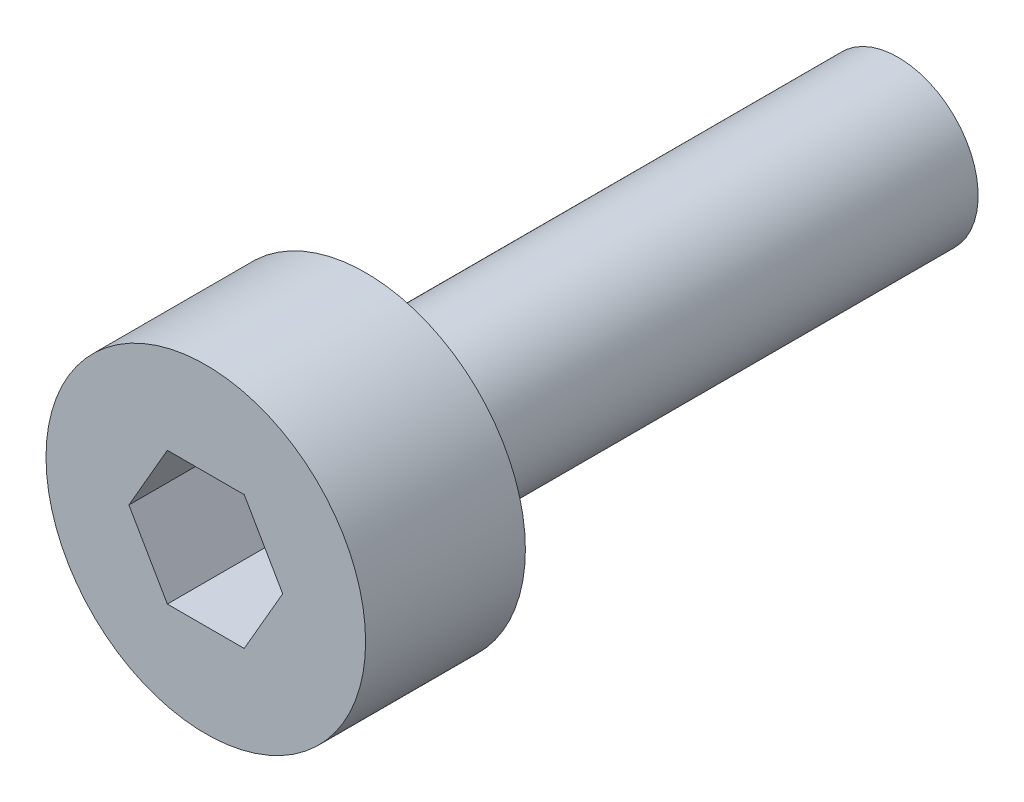
ISO-10303-21;
HEADER;
FILE_DESCRIPTION(('STEP AP214'),'2;1');
FILE_NAME('part.step','',(''),(''),'','','');
FILE_SCHEMA(('AUTOMOTIVE_DESIGN { 1 0 10303 214 1 1 1 1 }'));
ENDSEC;
DATA;
#1=APPLICATION_CONTEXT('core data for automotive mechanical design processes');
#2=APPLICATION_PROTOCOL_DEFINITION('international standard','automotive_design',2000,#1);
#3=PRODUCT_CONTEXT('',#1,'mechanical');
#4=PRODUCT('Part','Part','',(#3));
#5=PRODUCT_RELATED_PRODUCT_CATEGORY('part','',(#4));
#6=PRODUCT_DEFINITION_FORMATION('','',#4);
#7=PRODUCT_DEFINITION_CONTEXT('part definition',#1,'design');
#8=PRODUCT_DEFINITION('design','',#6,#7);
#9=PRODUCT_DEFINITION_SHAPE('','',#8);
#10=(LENGTH_UNIT() NAMED_UNIT(*) SI_UNIT(.MILLI.,.METRE.));
#11=(NAMED_UNIT(*) PLANE_ANGLE_UNIT() SI_UNIT($,.RADIAN.));
#12=(NAMED_UNIT(*) SI_UNIT($,.STERADIAN.) SOLID_ANGLE_UNIT());
#13=UNCERTAINTY_MEASURE_WITH_UNIT(LENGTH_MEASURE(1.E-05),#10,'distance_accuracy_value','');
#14=(GEOMETRIC_REPRESENTATION_CONTEXT(3) GLOBAL_UNCERTAINTY_ASSIGNED_CONTEXT((#13)) GLOBAL_UNIT_ASSIGNED_CONTEXT((#10,
#11,#12)) REPRESENTATION_CONTEXT('',''));
#15=CARTESIAN_POINT('',(0.,0.,0.));
#16=DIRECTION('',(0.,0.,1.));
#17=DIRECTION('',(1.,0.,0.));
#18=AXIS2_PLACEMENT_3D('',#15,#16,#17);
#19=CARTESIAN_POINT('',(0.,0.,3.));
#20=DIRECTION('',(0.,0.,-1.));
#21=DIRECTION('',(-1.,0.,0.));
#22=AXIS2_PLACEMENT_3D('',#19,#20,#21);
#23=CYLINDRICAL_SURFACE('',#22,3.);
#24=CARTESIAN_POINT('',(0.,0.,3.));
#25=DIRECTION('',(0.,0.,1.));
#26=DIRECTION('',(1.,0.,0.));
#27=AXIS2_PLACEMENT_3D('',#24,#25,#26);
#28=CIRCLE('',#27,3.);
#29=CARTESIAN_POINT('',(3.,0.,3.));
#30=VERTEX_POINT('',#29);
#31=EDGE_CURVE('E54',#30,#30,#28,.T.);
#32=ORIENTED_EDGE('',*,*,#31,.F.);
#33=EDGE_LOOP('',(#32));
#34=FACE_BOUND('',#33,.T.);
#35=CARTESIAN_POINT('',(0.,0.,0.));
#36=DIRECTION('',(0.,0.,1.));
#37=DIRECTION('',(1.,0.,0.));
#38=AXIS2_PLACEMENT_3D('',#35,#36,#37);
#39=CIRCLE('',#38,3.);
#40=CARTESIAN_POINT('',(3.,0.,0.));
#41=VERTEX_POINT('',#40);
#42=EDGE_CURVE('E48',#41,#41,#39,.T.);
#43=ORIENTED_EDGE('',*,*,#42,.T.);
#44=EDGE_LOOP('',(#43));
#45=FACE_BOUND('',#44,.T.);
#46=ADVANCED_FACE('F45',(#34,#45),#23,.T.);
#47=CARTESIAN_POINT('',(0.,0.,3.));
#48=DIRECTION('',(0.,0.,1.));
#49=DIRECTION('',(1.,0.,0.));
#50=AXIS2_PLACEMENT_3D('',#47,#48,#49);
#51=PLANE('',#50);
#52=DIRECTION('',(0.5,0.866025403784439,0.));
#53=VECTOR('',#52,1.);
#54=CARTESIAN_POINT('',(0.721687836487033,-1.25,3.));
#55=LINE('',#54,#53);
#56=CARTESIAN_POINT('',(0.721687836487033,-1.25,3.));
#57=VERTEX_POINT('',#56);
#58=CARTESIAN_POINT('',(1.44337567297407,0.,3.));
#59=VERTEX_POINT('',#58);
#60=EDGE_CURVE('E62',#57,#59,#55,.T.);
#61=ORIENTED_EDGE('',*,*,#60,.F.);
#62=DIRECTION('',(1.,0.,0.));
#63=VECTOR('',#62,1.);
#64=CARTESIAN_POINT('',(-0.721687836487031,-1.25,3.));
#65=LINE('',#64,#63);
#66=CARTESIAN_POINT('',(-0.721687836487031,-1.25,3.));
#67=VERTEX_POINT('',#66);
#68=EDGE_CURVE('E156',#67,#57,#65,.T.);
#69=ORIENTED_EDGE('',*,*,#68,.F.);
#70=DIRECTION('',(0.5,-0.866025403784438,0.));
#71=VECTOR('',#70,1.);
#72=CARTESIAN_POINT('',(-1.44337567297406,0.,3.));
#73=LINE('',#72,#71);
#74=CARTESIAN_POINT('',(-1.44337567297406,0.,3.));
#75=VERTEX_POINT('',#74);
#76=EDGE_CURVE('E153',#75,#67,#73,.T.);
#77=ORIENTED_EDGE('',*,*,#76,.F.);
#78=DIRECTION('',(-0.5,-0.866025403784439,0.));
#79=VECTOR('',#78,1.);
#80=CARTESIAN_POINT('',(-0.721687836487032,1.25,3.));
#81=LINE('',#80,#79);
#82=CARTESIAN_POINT('',(-0.721687836487032,1.25,3.));
#83=VERTEX_POINT('',#82);
#84=EDGE_CURVE('E110',#83,#75,#81,.T.);
#85=ORIENTED_EDGE('',*,*,#84,.F.);
#86=DIRECTION('',(-1.,0.,0.));
#87=VECTOR('',#86,1.);
#88=CARTESIAN_POINT('',(0.721687836487032,1.25,3.));
#89=LINE('',#88,#87);
#90=CARTESIAN_POINT('',(0.721687836487032,1.25,3.));
#91=VERTEX_POINT('',#90);
#92=EDGE_CURVE('E147',#91,#83,#89,.T.);
#93=ORIENTED_EDGE('',*,*,#92,.F.);
#94=DIRECTION('',(-0.5,0.866025403784438,0.));
#95=VECTOR('',#94,1.);
#96=CARTESIAN_POINT('',(1.44337567297406,0.,3.));
#97=LINE('',#96,#95);
#98=EDGE_CURVE('E142',#59,#91,#97,.T.);
#99=ORIENTED_EDGE('',*,*,#98,.F.);
#100=EDGE_LOOP('',(#61,#69,#77,#85,#93,#99));
#101=FACE_BOUND('',#100,.T.);
#102=ORIENTED_EDGE('',*,*,#31,.T.);
#103=EDGE_LOOP('',(#102));
#104=FACE_BOUND('',#103,.T.);
#105=ADVANCED_FACE('F182',(#101,#104),#51,.T.);
#106=CARTESIAN_POINT('',(0.,0.,0.));
#107=DIRECTION('',(0.,0.,1.));
#108=DIRECTION('',(1.,0.,0.));
#109=AXIS2_PLACEMENT_3D('',#106,#107,#108);
#110=PLANE('',#109);
#111=CARTESIAN_POINT('',(0.,0.,0.));
#112=DIRECTION('',(0.,0.,-1.));
#113=DIRECTION('',(-1.,0.,0.));
#114=AXIS2_PLACEMENT_3D('',#111,#112,#113);
#115=CIRCLE('',#114,1.5);
#116=CARTESIAN_POINT('',(-1.5,0.,0.));
#117=VERTEX_POINT('',#116);
#118=EDGE_CURVE('E11',#117,#117,#115,.T.);
#119=ORIENTED_EDGE('',*,*,#118,.F.);
#120=EDGE_LOOP('',(#119));
#121=FACE_BOUND('',#120,.T.);
#122=ORIENTED_EDGE('',*,*,#42,.F.);
#123=EDGE_LOOP('',(#122));
#124=FACE_BOUND('',#123,.T.);
#125=ADVANCED_FACE('F179',(#121,#124),#110,.F.);
#126=CARTESIAN_POINT('',(0.721687836487033,-1.25,1.));
#127=DIRECTION('',(0.866025403784439,-0.5,0.));
#128=DIRECTION('',(0.5,0.866025403784439,0.));
#129=AXIS2_PLACEMENT_3D('',#126,#127,#128);
#130=PLANE('',#129);
#131=ORIENTED_EDGE('',*,*,#60,.T.);
#132=DIRECTION('',(0.,0.,1.));
#133=VECTOR('',#132,1.);
#134=CARTESIAN_POINT('',(1.44337567297406,0.,1.));
#135=LINE('',#134,#133);
#136=CARTESIAN_POINT('',(1.44337567297406,0.,1.));
#137=VERTEX_POINT('',#136);
#138=EDGE_CURVE('E92',#137,#59,#135,.T.);
#139=ORIENTED_EDGE('',*,*,#138,.F.);
#140=DIRECTION('',(0.5,0.866025403784439,0.));
#141=VECTOR('',#140,1.);
#142=CARTESIAN_POINT('',(0.721687836487033,-1.25,1.));
#143=LINE('',#142,#141);
#144=CARTESIAN_POINT('',(0.721687836487033,-1.25,1.));
#145=VERTEX_POINT('',#144);
#146=EDGE_CURVE('E159',#145,#137,#143,.T.);
#147=ORIENTED_EDGE('',*,*,#146,.F.);
#148=DIRECTION('',(0.,0.,1.));
#149=VECTOR('',#148,1.);
#150=CARTESIAN_POINT('',(0.721687836487033,-1.25,1.));
#151=LINE('',#150,#149);
#152=EDGE_CURVE('E70',#145,#57,#151,.T.);
#153=ORIENTED_EDGE('',*,*,#152,.T.);
#154=EDGE_LOOP('',(#131,#139,#147,#153));
#155=FACE_BOUND('',#154,.T.);
#156=ADVANCED_FACE('F181',(#155),#130,.F.);
#157=CARTESIAN_POINT('',(-0.721687836487031,-1.25,1.));
#158=DIRECTION('',(0.,-1.,0.));
#159=DIRECTION('',(0.,0.,-1.));
#160=AXIS2_PLACEMENT_3D('',#157,#158,#159);
#161=PLANE('',#160);
#162=ORIENTED_EDGE('',*,*,#68,.T.);
#163=ORIENTED_EDGE('',*,*,#152,.F.);
#164=DIRECTION('',(1.,0.,0.));
#165=VECTOR('',#164,1.);
#166=CARTESIAN_POINT('',(-0.721687836487031,-1.25,1.));
#167=LINE('',#166,#165);
#168=CARTESIAN_POINT('',(-0.721687836487031,-1.25,1.));
#169=VERTEX_POINT('',#168);
#170=EDGE_CURVE('E124',#169,#145,#167,.T.);
#171=ORIENTED_EDGE('',*,*,#170,.F.);
#172=DIRECTION('',(0.,0.,1.));
#173=VECTOR('',#172,1.);
#174=CARTESIAN_POINT('',(-0.721687836487031,-1.25,1.));
#175=LINE('',#174,#173);
#176=EDGE_CURVE('E115',#169,#67,#175,.T.);
#177=ORIENTED_EDGE('',*,*,#176,.T.);
#178=EDGE_LOOP('',(#162,#163,#171,#177));
#179=FACE_BOUND('',#178,.T.);
#180=ADVANCED_FACE('F189',(#179),#161,.F.);
#181=CARTESIAN_POINT('',(-1.44337567297406,0.,1.));
#182=DIRECTION('',(-0.866025403784438,-0.5,0.));
#183=DIRECTION('',(0.5,-0.866025403784438,0.));
#184=AXIS2_PLACEMENT_3D('',#181,#182,#183);
#185=PLANE('',#184);
#186=ORIENTED_EDGE('',*,*,#76,.T.);
#187=ORIENTED_EDGE('',*,*,#176,.F.);
#188=DIRECTION('',(0.5,-0.866025403784438,0.));
#189=VECTOR('',#188,1.);
#190=CARTESIAN_POINT('',(-1.44337567297406,0.,1.));
#191=LINE('',#190,#189);
#192=CARTESIAN_POINT('',(-1.44337567297406,0.,1.));
#193=VERTEX_POINT('',#192);
#194=EDGE_CURVE('E119',#193,#169,#191,.T.);
#195=ORIENTED_EDGE('',*,*,#194,.F.);
#196=DIRECTION('',(0.,0.,1.));
#197=VECTOR('',#196,1.);
#198=CARTESIAN_POINT('',(-1.44337567297406,0.,1.));
#199=LINE('',#198,#197);
#200=EDGE_CURVE('E103',#193,#75,#199,.T.);
#201=ORIENTED_EDGE('',*,*,#200,.T.);
#202=EDGE_LOOP('',(#186,#187,#195,#201));
#203=FACE_BOUND('',#202,.T.);
#204=ADVANCED_FACE('F120',(#203),#185,.F.);
#205=CARTESIAN_POINT('',(-0.721687836487032,1.25,1.));
#206=DIRECTION('',(-0.866025403784439,0.5,0.));
#207=DIRECTION('',(-0.5,-0.866025403784439,0.));
#208=AXIS2_PLACEMENT_3D('',#205,#206,#207);
#209=PLANE('',#208);
#210=ORIENTED_EDGE('',*,*,#84,.T.);
#211=ORIENTED_EDGE('',*,*,#200,.F.);
#212=DIRECTION('',(-0.5,-0.866025403784439,0.));
#213=VECTOR('',#212,1.);
#214=CARTESIAN_POINT('',(-0.721687836487032,1.25,1.));
#215=LINE('',#214,#213);
#216=CARTESIAN_POINT('',(-0.721687836487032,1.25,1.));
#217=VERTEX_POINT('',#216);
#218=EDGE_CURVE('E107',#217,#193,#215,.T.);
#219=ORIENTED_EDGE('',*,*,#218,.F.);
#220=DIRECTION('',(0.,0.,1.));
#221=VECTOR('',#220,1.);
#222=CARTESIAN_POINT('',(-0.721687836487032,1.25,1.));
#223=LINE('',#222,#221);
#224=EDGE_CURVE('E116',#217,#83,#223,.T.);
#225=ORIENTED_EDGE('',*,*,#224,.T.);
#226=EDGE_LOOP('',(#210,#211,#219,#225));
#227=FACE_BOUND('',#226,.T.);
#228=ADVANCED_FACE('F105',(#227),#209,.F.);
#229=CARTESIAN_POINT('',(0.721687836487032,1.25,1.));
#230=DIRECTION('',(0.,1.,0.));
#231=DIRECTION('',(0.,0.,1.));
#232=AXIS2_PLACEMENT_3D('',#229,#230,#231);
#233=PLANE('',#232);
#234=ORIENTED_EDGE('',*,*,#92,.T.);
#235=ORIENTED_EDGE('',*,*,#224,.F.);
#236=DIRECTION('',(-1.,0.,0.));
#237=VECTOR('',#236,1.);
#238=CARTESIAN_POINT('',(0.721687836487032,1.25,1.));
#239=LINE('',#238,#237);
#240=CARTESIAN_POINT('',(0.721687836487032,1.25,1.));
#241=VERTEX_POINT('',#240);
#242=EDGE_CURVE('E130',#241,#217,#239,.T.);
#243=ORIENTED_EDGE('',*,*,#242,.F.);
#244=DIRECTION('',(0.,0.,1.));
#245=VECTOR('',#244,1.);
#246=CARTESIAN_POINT('',(0.721687836487032,1.25,1.));
#247=LINE('',#246,#245);
#248=EDGE_CURVE('E166',#241,#91,#247,.T.);
#249=ORIENTED_EDGE('',*,*,#248,.T.);
#250=EDGE_LOOP('',(#234,#235,#243,#249));
#251=FACE_BOUND('',#250,.T.);
#252=ADVANCED_FACE('F230',(#251),#233,.F.);
#253=CARTESIAN_POINT('',(1.44337567297406,0.,1.));
#254=DIRECTION('',(0.866025403784438,0.5,0.));
#255=DIRECTION('',(-0.5,0.866025403784438,0.));
#256=AXIS2_PLACEMENT_3D('',#253,#254,#255);
#257=PLANE('',#256);
#258=ORIENTED_EDGE('',*,*,#98,.T.);
#259=ORIENTED_EDGE('',*,*,#248,.F.);
#260=DIRECTION('',(-0.5,0.866025403784438,0.));
#261=VECTOR('',#260,1.);
#262=CARTESIAN_POINT('',(1.44337567297406,0.,1.));
#263=LINE('',#262,#261);
#264=EDGE_CURVE('E134',#137,#241,#263,.T.);
#265=ORIENTED_EDGE('',*,*,#264,.F.);
#266=ORIENTED_EDGE('',*,*,#138,.T.);
#267=EDGE_LOOP('',(#258,#259,#265,#266));
#268=FACE_BOUND('',#267,.T.);
#269=ADVANCED_FACE('F238',(#268),#257,.F.);
#270=CARTESIAN_POINT('',(0.,0.,1.));
#271=DIRECTION('',(0.,0.,1.));
#272=DIRECTION('',(1.,0.,0.));
#273=AXIS2_PLACEMENT_3D('',#270,#271,#272);
#274=PLANE('',#273);
#275=ORIENTED_EDGE('',*,*,#146,.T.);
#276=ORIENTED_EDGE('',*,*,#264,.T.);
#277=ORIENTED_EDGE('',*,*,#242,.T.);
#278=ORIENTED_EDGE('',*,*,#218,.T.);
#279=ORIENTED_EDGE('',*,*,#194,.T.);
#280=ORIENTED_EDGE('',*,*,#170,.T.);
#281=EDGE_LOOP('',(#275,#276,#277,#278,#279,#280));
#282=FACE_BOUND('',#281,.T.);
#283=ADVANCED_FACE('F127',(#282),#274,.T.);
#284=CARTESIAN_POINT('',(0.,0.,-10.));
#285=DIRECTION('',(0.,0.,1.));
#286=DIRECTION('',(1.,0.,0.));
#287=AXIS2_PLACEMENT_3D('',#284,#285,#286);
#288=CYLINDRICAL_SURFACE('',#287,1.5);
#289=CARTESIAN_POINT('',(0.,0.,-10.));
#290=DIRECTION('',(0.,0.,-1.));
#291=DIRECTION('',(-1.,0.,0.));
#292=AXIS2_PLACEMENT_3D('',#289,#290,#291);
#293=CIRCLE('',#292,1.5);
#294=CARTESIAN_POINT('',(-1.5,0.,-10.));
#295=VERTEX_POINT('',#294);
#296=EDGE_CURVE('E143',#295,#295,#293,.T.);
#297=ORIENTED_EDGE('',*,*,#296,.F.);
#298=EDGE_LOOP('',(#297));
#299=FACE_BOUND('',#298,.T.);
#300=ORIENTED_EDGE('',*,*,#118,.T.);
#301=EDGE_LOOP('',(#300));
#302=FACE_BOUND('',#301,.T.);
#303=ADVANCED_FACE('F253',(#299,#302),#288,.T.);
#304=CARTESIAN_POINT('',(0.,0.,-10.));
#305=DIRECTION('',(0.,0.,-1.));
#306=DIRECTION('',(-1.,0.,0.));
#307=AXIS2_PLACEMENT_3D('',#304,#305,#306);
#308=PLANE('',#307);
#309=ORIENTED_EDGE('',*,*,#296,.T.);
#310=EDGE_LOOP('',(#309));
#311=FACE_BOUND('',#310,.T.);
#312=ADVANCED_FACE('F264',(#311),#308,.T.);
#313=CLOSED_SHELL('',(#46,#105,#125,#156,#180,#204,#228,#252,#269,#283,#303,#312));
#314=MANIFOLD_SOLID_BREP('B2',#313);
#315=ADVANCED_BREP_SHAPE_REPRESENTATION('',(#18,#314),#14);
#316=SHAPE_DEFINITION_REPRESENTATION(#9,#315);
ENDSEC;
END-ISO-10303-21;
